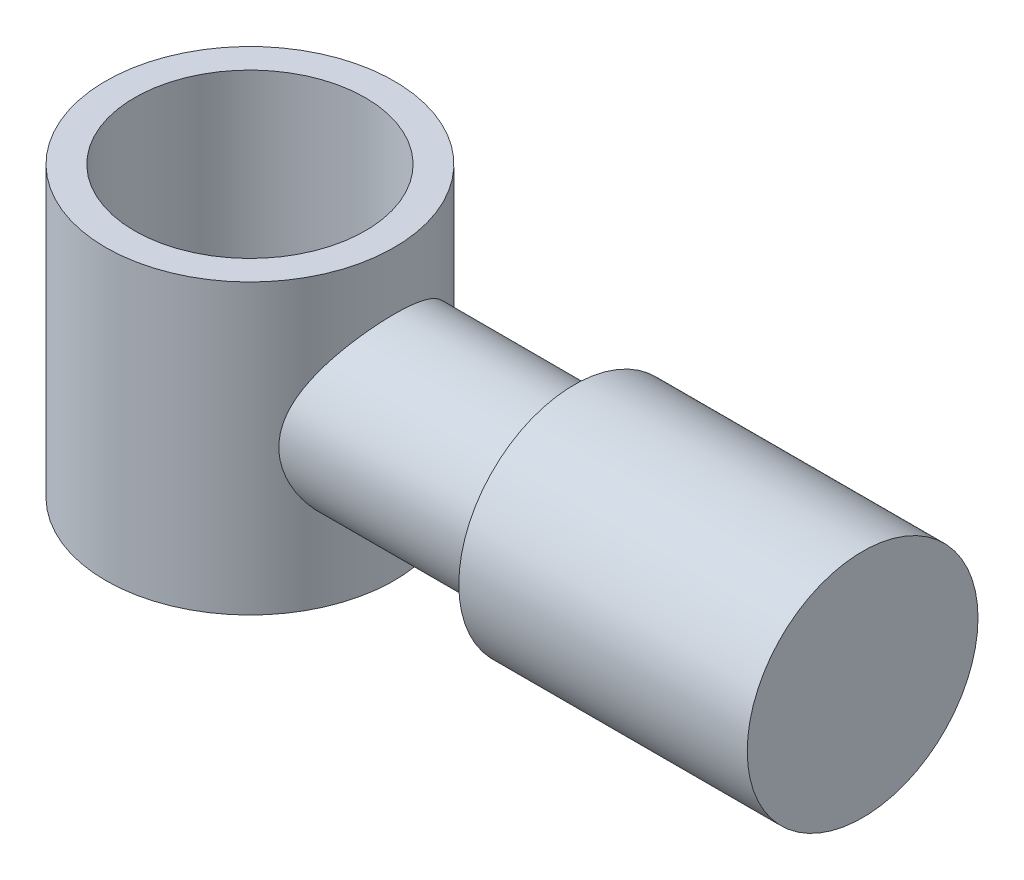
ISO-10303-21;
HEADER;
FILE_DESCRIPTION(('STEP AP214'),'2;1');
FILE_NAME('part.step','',(''),(''),'','','');
FILE_SCHEMA(('AUTOMOTIVE_DESIGN { 1 0 10303 214 1 1 1 1 }'));
ENDSEC;
DATA;
#1=APPLICATION_CONTEXT('core data for automotive mechanical design processes');
#2=APPLICATION_PROTOCOL_DEFINITION('international standard','automotive_design',2000,#1);
#3=PRODUCT_CONTEXT('',#1,'mechanical');
#4=PRODUCT('Part','Part','',(#3));
#5=PRODUCT_RELATED_PRODUCT_CATEGORY('part','',(#4));
#6=PRODUCT_DEFINITION_FORMATION('','',#4);
#7=PRODUCT_DEFINITION_CONTEXT('part definition',#1,'design');
#8=PRODUCT_DEFINITION('design','',#6,#7);
#9=PRODUCT_DEFINITION_SHAPE('','',#8);
#10=(LENGTH_UNIT() NAMED_UNIT(*) SI_UNIT(.MILLI.,.METRE.));
#11=(NAMED_UNIT(*) PLANE_ANGLE_UNIT() SI_UNIT($,.RADIAN.));
#12=(NAMED_UNIT(*) SI_UNIT($,.STERADIAN.) SOLID_ANGLE_UNIT());
#13=UNCERTAINTY_MEASURE_WITH_UNIT(LENGTH_MEASURE(1.E-05),#10,'distance_accuracy_value','');
#14=(GEOMETRIC_REPRESENTATION_CONTEXT(3) GLOBAL_UNCERTAINTY_ASSIGNED_CONTEXT((#13)) GLOBAL_UNIT_ASSIGNED_CONTEXT((#10,
#11,#12)) REPRESENTATION_CONTEXT('',''));
#15=CARTESIAN_POINT('',(0.,0.,0.));
#16=DIRECTION('',(0.,0.,1.));
#17=DIRECTION('',(1.,0.,0.));
#18=AXIS2_PLACEMENT_3D('',#15,#16,#17);
#19=CARTESIAN_POINT('',(0.,50.,0.));
#20=DIRECTION('',(0.,-1.,0.));
#21=DIRECTION('',(0.,0.,-1.));
#22=AXIS2_PLACEMENT_3D('',#19,#20,#21);
#23=CYLINDRICAL_SURFACE('',#22,50.);
#24=CARTESIAN_POINT('',(40.,0.,-30.));
#25=CARTESIAN_POINT('',(39.9999924355509,-0.754773079428565,-30.0000054371733));
#26=CARTESIAN_POINT('',(40.0214403954393,-1.50948924622845,-29.9714752342614));
#27=CARTESIAN_POINT('',(40.1062444493847,-3.0122226461602,-29.8578998383123));
#28=CARTESIAN_POINT('',(40.1695977533699,-3.76024032191946,-29.7728584078095));
#29=CARTESIAN_POINT('',(40.3355499097489,-5.2441364599569,-29.5476372030003));
#30=CARTESIAN_POINT('',(40.438184622088,-5.98000318745316,-29.4074070436577));
#31=CARTESIAN_POINT('',(40.6785728662393,-7.43373400086841,-29.0739716563499));
#32=CARTESIAN_POINT('',(40.8163282339694,-8.15159714350204,-28.8807636589501));
#33=CARTESIAN_POINT('',(41.1208174466127,-9.55986424580085,-28.445531905068));
#34=CARTESIAN_POINT('',(41.2873290187728,-10.2504322497716,-28.2038804459786));
#35=CARTESIAN_POINT('',(41.644790948041,-11.6067524308452,-27.6733374325039));
#36=CARTESIAN_POINT('',(41.8357445215649,-12.2725013269922,-27.3844396594046));
#37=CARTESIAN_POINT('',(42.1364605134893,-13.2505717076948,-26.9175218389558));
#38=CARTESIAN_POINT('',(42.2391003045645,-13.5732271148505,-26.756254628249));
#39=CARTESIAN_POINT('',(42.4484734074239,-14.2113934734989,-26.4228282782668));
#40=CARTESIAN_POINT('',(42.5552056486378,-14.5269062595888,-26.2506719799854));
#41=CARTESIAN_POINT('',(42.8806472634173,-15.4626009873731,-25.7181480386));
#42=CARTESIAN_POINT('',(43.1045955804228,-16.0719201724563,-25.3417344973462));
#43=CARTESIAN_POINT('',(43.5893887462092,-17.3324425072035,-24.499575785768));
#44=CARTESIAN_POINT('',(43.8513964328546,-17.9796546133088,-24.0285354757498));
#45=CARTESIAN_POINT('',(44.3801358051688,-19.233290460478,-23.0373408991427));
#46=CARTESIAN_POINT('',(44.6468677620499,-19.8397118501679,-22.5171838053726));
#47=CARTESIAN_POINT('',(45.1790404761606,-21.0099367523766,-21.4294452953907));
#48=CARTESIAN_POINT('',(45.4444801847927,-21.573709768574,-20.8618305432127));
#49=CARTESIAN_POINT('',(45.9679876279243,-22.6556839826832,-19.681488615426));
#50=CARTESIAN_POINT('',(46.2260549858159,-23.1738828552944,-19.0687591408844));
#51=CARTESIAN_POINT('',(46.7564021460829,-24.2153507973842,-17.7316223686081));
#52=CARTESIAN_POINT('',(47.0271973104288,-24.7330987799033,-17.0023054886216));
#53=CARTESIAN_POINT('',(47.5453815754836,-25.7047112154735,-15.4942685286804));
#54=CARTESIAN_POINT('',(47.7927685483637,-26.158569862743,-14.715543968244));
#55=CARTESIAN_POINT('',(48.2568802958075,-26.9971922251109,-13.1136665383535));
#56=CARTESIAN_POINT('',(48.4736264229592,-27.3820041074603,-12.2905451657093));
#57=CARTESIAN_POINT('',(48.870041879193,-28.0777989799473,-10.6050928823802));
#58=CARTESIAN_POINT('',(49.0497173006521,-28.3887941027499,-9.74276844298749));
#59=CARTESIAN_POINT('',(49.3510766635053,-28.9062031952631,-8.06989441005334));
#60=CARTESIAN_POINT('',(49.4766580911894,-29.1197644658465,-7.26225533212928));
#61=CARTESIAN_POINT('',(49.6891894498777,-29.4794276662173,-5.62706899055213));
#62=CARTESIAN_POINT('',(49.7761416205889,-29.6255335070595,-4.79952288403311));
#63=CARTESIAN_POINT('',(49.9087796773502,-29.8478515838854,-3.13246717024253));
#64=CARTESIAN_POINT('',(49.9544978737898,-29.924118545397,-2.29296745458034));
#65=CARTESIAN_POINT('',(50.0033768126454,-30.0056462782551,-0.609322714269916));
#66=CARTESIAN_POINT('',(50.0065418849347,-30.0109142739014,0.234821829012514));
#67=CARTESIAN_POINT('',(49.9725033434349,-29.95415500019,1.81489529981785));
#68=CARTESIAN_POINT('',(49.9402633154867,-29.9004022371462,2.55124667795299));
#69=CARTESIAN_POINT('',(49.8438693758083,-29.739124395353,4.01585794086052));
#70=CARTESIAN_POINT('',(49.7797187521094,-29.6316048566647,4.74411865138387));
#71=CARTESIAN_POINT('',(49.620977165127,-29.3641437085351,6.18756243161352));
#72=CARTESIAN_POINT('',(49.5263851106974,-29.20420022,6.90274503157525));
#73=CARTESIAN_POINT('',(49.3088598139461,-28.8337670024337,8.31547959196037));
#74=CARTESIAN_POINT('',(49.1859254038559,-28.6232751906837,9.01303082461759));
#75=CARTESIAN_POINT('',(48.9135476146462,-28.1526581576168,10.3904072750655));
#76=CARTESIAN_POINT('',(48.7639571594241,-27.8922569228414,11.0701088227145));
#77=CARTESIAN_POINT('',(48.441789827711,-27.3251067169327,12.4041910107697));
#78=CARTESIAN_POINT('',(48.2692131671293,-27.0183581811358,13.0585718889383));
#79=CARTESIAN_POINT('',(47.9043659781244,-26.3610135406394,14.3392870539587));
#80=CARTESIAN_POINT('',(47.7120927225473,-26.0104113625566,14.9656174396906));
#81=CARTESIAN_POINT('',(47.3113861831583,-25.2678641870583,16.1878487666349));
#82=CARTESIAN_POINT('',(47.1029518864841,-24.8759165978422,16.783747796732));
#83=CARTESIAN_POINT('',(46.6479274519125,-24.0038251222862,18.0124884902317));
#84=CARTESIAN_POINT('',(46.3997536842666,-23.5187386533106,18.6412397419404));
#85=CARTESIAN_POINT('',(45.8930644751573,-22.502607304962,19.8559772510624));
#86=CARTESIAN_POINT('',(45.6345483218784,-21.9715592593429,20.4419605571017));
#87=CARTESIAN_POINT('',(45.1123778800076,-20.8653945949799,21.569887598821));
#88=CARTESIAN_POINT('',(44.8487174528413,-20.2902225786288,22.1117741531459));
#89=CARTESIAN_POINT('',(44.3223864406096,-19.0986815642021,23.1487409834838));
#90=CARTESIAN_POINT('',(44.0597159018081,-18.4823106652618,23.6438190972658));
#91=CARTESIAN_POINT('',(43.5114023855333,-17.1365792062999,24.6397506704863));
#92=CARTESIAN_POINT('',(43.2266309181986,-16.4024071704545,25.134607075518));
#93=CARTESIAN_POINT('',(42.6750161739419,-14.8880542042171,26.060187845091));
#94=CARTESIAN_POINT('',(42.4081758489753,-14.107865737769,26.4909016641373));
#95=CARTESIAN_POINT('',(41.9025771259453,-12.5060980569954,27.2835991057643));
#96=CARTESIAN_POINT('',(41.663776855557,-11.6845832451743,27.6456857193192));
#97=CARTESIAN_POINT('',(41.2239700066492,-10.0036296959614,28.2973336841537));
#98=CARTESIAN_POINT('',(41.0229485892923,-9.144206012938,28.586923525734));
#99=CARTESIAN_POINT('',(40.7124607158074,-7.61055439517443,29.0266922229524));
#100=CARTESIAN_POINT('',(40.5926498926779,-6.94318574540926,29.1936352760004));
#101=CARTESIAN_POINT('',(40.3837646228614,-5.59394741557895,29.4819157838905));
#102=CARTESIAN_POINT('',(40.2946852685501,-4.91208006934632,29.6032605207762));
#103=CARTESIAN_POINT('',(40.1504262123343,-3.53871644845567,29.7986252970483));
#104=CARTESIAN_POINT('',(40.0952129290315,-2.847230409919,29.8726922198134));
#105=CARTESIAN_POINT('',(40.0205909917451,-1.45881623193731,29.9725913229736));
#106=CARTESIAN_POINT('',(40.0011830970955,-0.761887977392609,29.9984224804208));
#107=CARTESIAN_POINT('',(39.9989205730711,0.633092969562075,30.001439292512));
#108=CARTESIAN_POINT('',(40.016116263115,1.33114588996814,29.9785579814936));
#109=CARTESIAN_POINT('',(40.0864993514701,2.72212786656803,29.8843768935634));
#110=CARTESIAN_POINT('',(40.1396869372494,3.41505689605442,29.8130768644567));
#111=CARTESIAN_POINT('',(40.2801155116223,4.79132027707059,29.6230684849219));
#112=CARTESIAN_POINT('',(40.3673793756117,5.47464786325117,29.5043282866804));
#113=CARTESIAN_POINT('',(40.5729035284754,6.82695351863887,29.2210546703214));
#114=CARTESIAN_POINT('',(40.6911646881071,7.49593118416539,29.0565199657639));
#115=CARTESIAN_POINT('',(40.9546817127304,8.81493130388343,28.6838971255832));
#116=CARTESIAN_POINT('',(41.099893970628,9.46498244311764,28.4758792783311));
#117=CARTESIAN_POINT('',(41.4133350881076,10.7447421919884,28.0180764187168));
#118=CARTESIAN_POINT('',(41.5815731918176,11.3744425052817,27.7682746224651));
#119=CARTESIAN_POINT('',(41.9367586997092,12.6112149171688,27.2288911048792));
#120=CARTESIAN_POINT('',(42.1237096452986,13.2182827026054,26.9393018498846));
#121=CARTESIAN_POINT('',(42.5119906697039,14.4078239321894,26.3223000055147));
#122=CARTESIAN_POINT('',(42.713317060781,14.9903036233565,25.9948971032765));
#123=CARTESIAN_POINT('',(43.1636078905243,16.2323716245478,25.2414085206861));
#124=CARTESIAN_POINT('',(43.4146109863377,16.8868967379914,24.8081780488878));
#125=CARTESIAN_POINT('',(43.9246536038002,18.1580335537829,23.8934940052003));
#126=CARTESIAN_POINT('',(44.1836938512659,18.7746418168658,23.4120360691993));
#127=CARTESIAN_POINT('',(44.7040326920285,19.9684598947072,22.4025038732756));
#128=CARTESIAN_POINT('',(44.9653330646558,20.5456347277241,21.8743891519663));
#129=CARTESIAN_POINT('',(45.4842796758364,21.6578301169655,20.7737943393439));
#130=CARTESIAN_POINT('',(45.7419257245319,22.1928484895119,20.2013119528565));
#131=CARTESIAN_POINT('',(46.2811171660542,23.2851001855273,18.9364779766343));
#132=CARTESIAN_POINT('',(46.5614043507672,23.8361500707667,18.2382257014387));
#133=CARTESIAN_POINT('',(47.1028396436449,24.8772013130106,16.7904682073809));
#134=CARTESIAN_POINT('',(47.3639857916585,25.367196421245,16.0409577545394));
#135=CARTESIAN_POINT('',(47.8597679650153,26.281262214501,14.4948690885772));
#136=CARTESIAN_POINT('',(48.0944166466547,26.7053644094267,13.6983136253921));
#137=CARTESIAN_POINT('',(48.5304710877414,27.4829085808844,12.0627242110709));
#138=CARTESIAN_POINT('',(48.731881378668,27.8363601907911,11.2236960707639));
#139=CARTESIAN_POINT('',(49.0820154369011,28.4447091895007,9.57163089673217));
#140=CARTESIAN_POINT('',(49.2335028420043,28.7048990218314,8.76112996669413));
#141=CARTESIAN_POINT('',(49.4981910314828,29.1565507968783,7.11503534150898));
#142=CARTESIAN_POINT('',(49.6113932400335,29.3480152961319,6.27944258101491));
#143=CARTESIAN_POINT('',(49.7959943798632,29.6590072808807,4.59121918613498));
#144=CARTESIAN_POINT('',(49.8674326814406,29.7786025195841,3.73860538410504));
#145=CARTESIAN_POINT('',(49.9664050743555,29.9440494730322,2.02375863082273));
#146=CARTESIAN_POINT('',(49.9939448890237,29.989910800952,1.16152694827898));
#147=CARTESIAN_POINT('',(50.0035796163062,30.0059636845279,-0.44863836959643));
#148=CARTESIAN_POINT('',(49.9912497430118,29.9854383726646,-1.19646649879256));
#149=CARTESIAN_POINT('',(49.9333091422452,29.8887419424398,-2.68715701856051));
#150=CARTESIAN_POINT('',(49.8877020198906,29.8125768518574,-3.43001993824537));
#151=CARTESIAN_POINT('',(49.7643009048837,29.6056163790939,-4.90534527411017));
#152=CARTESIAN_POINT('',(49.6865071367958,29.4748213780623,-5.63780776281639));
#153=CARTESIAN_POINT('',(49.5005437474305,29.160245460038,-7.0873223698818));
#154=CARTESIAN_POINT('',(49.3923732157727,28.9764629550249,-7.80437402569054));
#155=CARTESIAN_POINT('',(49.1500473875609,28.5614260115334,-9.20713596965784));
#156=CARTESIAN_POINT('',(49.0163393490528,28.3309850756384,-9.89316522831643));
#157=CARTESIAN_POINT('',(48.7246154429874,27.8232155122072,-11.242249514208));
#158=CARTESIAN_POINT('',(48.5666001756052,27.5458880423398,-11.9053051081935));
#159=CARTESIAN_POINT('',(48.2293178600434,26.946769704929,-13.2054545723106));
#160=CARTESIAN_POINT('',(48.0500484828003,26.6249739638318,-13.8425455868989));
#161=CARTESIAN_POINT('',(47.6735789595604,25.9393946780803,-15.0881846024373));
#162=CARTESIAN_POINT('',(47.4763776858225,25.5756084922492,-15.6967308045441));
#163=CARTESIAN_POINT('',(47.0453184951055,24.7667424868672,-16.9476190424841));
#164=CARTESIAN_POINT('',(46.8098051726833,24.317124761882,-17.5864585689585));
#165=CARTESIAN_POINT('',(46.325936934833,23.3721450786188,-18.8241654588664));
#166=CARTESIAN_POINT('',(46.0775812628444,22.876780423972,-19.4230304625739));
#167=CARTESIAN_POINT('',(45.5728772295248,21.8424161446594,-20.5793876993337));
#168=CARTESIAN_POINT('',(45.3165210670254,21.3033730570058,-21.1368376378641));
#169=CARTESIAN_POINT('',(44.8013865884645,20.1844237054672,-22.2078589213948));
#170=CARTESIAN_POINT('',(44.5426081325414,19.6045150692523,-22.7214277151681));
#171=CARTESIAN_POINT('',(43.9954895932492,18.329631573187,-23.7652386100365));
#172=CARTESIAN_POINT('',(43.7075675480209,17.6293953373685,-24.2893195038196));
#173=CARTESIAN_POINT('',(43.2851540783708,16.5443485377289,-25.0295083694434));
#174=CARTESIAN_POINT('',(43.1459165421275,16.1768518277079,-25.2686007562634));
#175=CARTESIAN_POINT('',(42.8716442524079,15.4304379178484,-25.731195664513));
#176=CARTESIAN_POINT('',(42.7366110683665,15.0515165547962,-25.9546924020116));
#177=CARTESIAN_POINT('',(42.3397557549876,13.8987545541486,-26.6007590168042));
#178=CARTESIAN_POINT('',(42.0859808338299,13.1084169941735,-26.999246247833));
#179=CARTESIAN_POINT('',(41.6097198076573,11.4877271374779,-27.7276182166737));
#180=CARTESIAN_POINT('',(41.3872256518336,10.6573852109229,-28.0575206168377));
#181=CARTESIAN_POINT('',(41.0929389990196,9.42187298081651,-28.4850286249539));
#182=CARTESIAN_POINT('',(41.0048657325039,9.03038758470868,-28.6115719641199));
#183=CARTESIAN_POINT('',(40.8382373313778,8.24078837678755,-28.8489055913011));
#184=CARTESIAN_POINT('',(40.7596797970073,7.84267626508385,-28.9596998522838));
#185=CARTESIAN_POINT('',(40.5395886546573,6.63922693192673,-29.2678307379545));
#186=CARTESIAN_POINT('',(40.4135940279387,5.82460119453231,-29.440976404297));
#187=CARTESIAN_POINT('',(40.209493955114,4.17951386891395,-29.7191257226127));
#188=CARTESIAN_POINT('',(40.1312994945307,3.34908470349394,-29.8242560556143));
#189=CARTESIAN_POINT('',(40.0265599738779,1.67907944636471,-29.9646857763522));
#190=CARTESIAN_POINT('',(40.0000084136404,0.839504519189612,-29.9999939524452));
#191=CARTESIAN_POINT('',(40.,0.,-30.));
#192=B_SPLINE_CURVE_WITH_KNOTS('',3,(#24,#25,#26,#27,#28,#29,#30,#31,#32,#33,#34,#35,#36,#37,
#38,#39,#40,#41,#42,#43,#44,#45,#46,#47,#48,#49,#50,#51,#52,#53,#54,#55,#56,#57,#58,#59,#60,#61,
#62,#63,#64,#65,#66,#67,#68,#69,#70,#71,#72,#73,#74,#75,#76,#77,#78,#79,#80,#81,#82,#83,#84,#85,
#86,#87,#88,#89,#90,#91,#92,#93,#94,#95,#96,#97,#98,#99,#100,#101,#102,#103,#104,#105,#106,#107,
#108,#109,#110,#111,#112,#113,#114,#115,#116,#117,#118,#119,#120,#121,#122,#123,#124,#125,#126,
#127,#128,#129,#130,#131,#132,#133,#134,#135,#136,#137,#138,#139,#140,#141,#142,#143,#144,#145,
#146,#147,#148,#149,#150,#151,#152,#153,#154,#155,#156,#157,#158,#159,#160,#161,#162,#163,#164,
#165,#166,#167,#168,#169,#170,#171,#172,#173,#174,#175,#176,#177,#178,#179,#180,#181,#182,#183,
#184,#185,#186,#187,#188,#189,#190,#191),.UNSPECIFIED.,.T.,.F.,(4,2,2,2,2,2,2,2,2,2,2,2,2,2,2,2,
2,2,2,2,2,2,2,2,2,2,2,2,2,2,2,2,2,2,2,2,2,2,2,2,2,2,2,2,2,2,2,2,2,2,2,2,2,2,2,2,2,2,2,2,2,2,2,2,
2,2,2,2,2,2,2,2,2,2,2,2,2,2,2,2,2,2,2,4),(0.,2.26339065976523,4.52663063739906,6.79194167103308,
9.05737114715353,11.3060153718576,13.5549558090047,14.6798398054329,15.8044315174353,
18.053680844433,20.578006829107,23.1024782036475,25.6287380005962,28.1551266186056,
30.954941350871,33.7550103451903,36.553118342749,39.3507661189212,41.8814765390891,
44.4120402106454,46.9406192393127,49.4689409776018,51.683333411791,53.8974977247651,
56.1117414113421,58.3260763460167,60.5530302662239,62.7799632701391,65.0072050288865,
67.2345864887666,69.7280443332067,72.2216740863463,74.71848750613,77.2154162053875,
80.002108172649,82.7892577871951,85.5721909336379,88.354028700165,90.446781170665,
92.5391992867496,94.6295392047497,96.7199234526042,98.8131832342802,100.906453919041,
103.001132238211,105.095869406138,107.187246361405,109.279465412906,111.372081168462,
113.46416201983,115.933925800171,118.403913272111,120.876064180349,123.348343060374,
126.142642921312,128.937228535818,131.730473642596,134.523337623591,137.113418055671,
139.703402128459,142.290940703078,144.878141895905,147.120010063233,149.361635392023,
151.603245081396,153.844921958156,156.05044208409,158.25590776179,160.461615342147,
162.667461736035,165.112763633141,167.558209750834,170.006119860739,172.454172194157,
175.21302745175,176.592687183034,177.972855896356,180.731292892543,183.489018638118,
184.750877047949,186.012416565873,188.534926127152,191.052723792891,193.57020452896),.UNSPECIFIED.);
#193=CARTESIAN_POINT('',(40.,0.,-30.));
#194=VERTEX_POINT('',#193);
#195=EDGE_CURVE('E56',#194,#194,#192,.T.);
#196=ORIENTED_EDGE('',*,*,#195,.T.);
#197=EDGE_LOOP('',(#196));
#198=FACE_BOUND('',#197,.T.);
#199=ADVANCED_FACE('F51',(#198),#23,.F.);
#200=CARTESIAN_POINT('',(112.4,0.,0.));
#201=DIRECTION('',(-1.,0.,0.));
#202=DIRECTION('',(0.,0.,1.));
#203=AXIS2_PLACEMENT_3D('',#200,#201,#202);
#204=PLANE('',#203);
#205=CARTESIAN_POINT('',(112.4,0.,0.));
#206=DIRECTION('',(-1.,0.,0.));
#207=DIRECTION('',(0.,0.,1.));
#208=AXIS2_PLACEMENT_3D('',#205,#206,#207);
#209=CIRCLE('',#208,30.);
#210=CARTESIAN_POINT('',(112.4,0.,30.));
#211=VERTEX_POINT('',#210);
#212=EDGE_CURVE('E12',#211,#211,#209,.T.);
#213=ORIENTED_EDGE('',*,*,#212,.F.);
#214=EDGE_LOOP('',(#213));
#215=FACE_BOUND('',#214,.T.);
#216=ADVANCED_FACE('F70',(#215),#204,.F.);
#217=CARTESIAN_POINT('',(-50.002,0.,0.));
#218=DIRECTION('',(1.,0.,0.));
#219=DIRECTION('',(0.,0.,-1.));
#220=AXIS2_PLACEMENT_3D('',#217,#218,#219);
#221=CYLINDRICAL_SURFACE('',#220,30.);
#222=ORIENTED_EDGE('',*,*,#212,.T.);
#223=EDGE_LOOP('',(#222));
#224=FACE_BOUND('',#223,.T.);
#225=ORIENTED_EDGE('',*,*,#195,.F.);
#226=EDGE_LOOP('',(#225));
#227=FACE_BOUND('',#226,.T.);
#228=ADVANCED_FACE('F53',(#224,#227),#221,.T.);
#229=CLOSED_SHELL('',(#199,#216,#228));
#230=MANIFOLD_SOLID_BREP('B2',#229);
#231=CARTESIAN_POINT('',(212.4,0.,0.));
#232=DIRECTION('',(-1.,0.,0.));
#233=DIRECTION('',(0.,0.,1.));
#234=AXIS2_PLACEMENT_3D('',#231,#232,#233);
#235=CYLINDRICAL_SURFACE('',#234,40.);
#236=CARTESIAN_POINT('',(212.4,0.,0.));
#237=DIRECTION('',(1.,0.,0.));
#238=DIRECTION('',(0.,0.,-1.));
#239=AXIS2_PLACEMENT_3D('',#236,#237,#238);
#240=CIRCLE('',#239,40.);
#241=CARTESIAN_POINT('',(212.4,0.,-40.));
#242=VERTEX_POINT('',#241);
#243=EDGE_CURVE('E50',#242,#242,#240,.T.);
#244=ORIENTED_EDGE('',*,*,#243,.F.);
#245=EDGE_LOOP('',(#244));
#246=FACE_BOUND('',#245,.T.);
#247=CARTESIAN_POINT('',(112.4,0.,0.));
#248=DIRECTION('',(1.,0.,0.));
#249=DIRECTION('',(0.,0.,-1.));
#250=AXIS2_PLACEMENT_3D('',#247,#248,#249);
#251=CIRCLE('',#250,40.);
#252=CARTESIAN_POINT('',(112.4,0.,-40.));
#253=VERTEX_POINT('',#252);
#254=EDGE_CURVE('E106',#253,#253,#251,.T.);
#255=ORIENTED_EDGE('',*,*,#254,.T.);
#256=EDGE_LOOP('',(#255));
#257=FACE_BOUND('',#256,.T.);
#258=ADVANCED_FACE('F103',(#246,#257),#235,.T.);
#259=CARTESIAN_POINT('',(212.4,0.,0.));
#260=DIRECTION('',(1.,0.,0.));
#261=DIRECTION('',(0.,0.,-1.));
#262=AXIS2_PLACEMENT_3D('',#259,#260,#261);
#263=PLANE('',#262);
#264=ORIENTED_EDGE('',*,*,#243,.T.);
#265=EDGE_LOOP('',(#264));
#266=FACE_BOUND('',#265,.T.);
#267=ADVANCED_FACE('F118',(#266),#263,.T.);
#268=CARTESIAN_POINT('',(112.4,0.,0.));
#269=DIRECTION('',(1.,0.,0.));
#270=DIRECTION('',(0.,0.,-1.));
#271=AXIS2_PLACEMENT_3D('',#268,#269,#270);
#272=PLANE('',#271);
#273=ORIENTED_EDGE('',*,*,#254,.F.);
#274=EDGE_LOOP('',(#273));
#275=FACE_BOUND('',#274,.T.);
#276=ADVANCED_FACE('F116',(#275),#272,.F.);
#277=CLOSED_SHELL('',(#258,#267,#276));
#278=MANIFOLD_SOLID_BREP('B7',#277);
#279=CARTESIAN_POINT('',(0.,50.,0.));
#280=DIRECTION('',(0.,1.,0.));
#281=DIRECTION('',(0.,0.,1.));
#282=AXIS2_PLACEMENT_3D('',#279,#280,#281);
#283=PLANE('',#282);
#284=CARTESIAN_POINT('',(0.,50.,0.));
#285=DIRECTION('',(0.,1.,0.));
#286=DIRECTION('',(0.,0.,1.));
#287=AXIS2_PLACEMENT_3D('',#284,#285,#286);
#288=CIRCLE('',#287,50.);
#289=CARTESIAN_POINT('',(0.,50.,50.));
#290=VERTEX_POINT('',#289);
#291=EDGE_CURVE('E102',#290,#290,#288,.T.);
#292=ORIENTED_EDGE('',*,*,#291,.T.);
#293=EDGE_LOOP('',(#292));
#294=FACE_BOUND('',#293,.T.);
#295=CARTESIAN_POINT('',(0.,50.,0.));
#296=DIRECTION('',(0.,1.,0.));
#297=DIRECTION('',(0.,0.,1.));
#298=AXIS2_PLACEMENT_3D('',#295,#296,#297);
#299=CIRCLE('',#298,40.);
#300=CARTESIAN_POINT('',(0.,50.,40.));
#301=VERTEX_POINT('',#300);
#302=EDGE_CURVE('E154',#301,#301,#299,.T.);
#303=ORIENTED_EDGE('',*,*,#302,.F.);
#304=EDGE_LOOP('',(#303));
#305=FACE_BOUND('',#304,.T.);
#306=ADVANCED_FACE('F143',(#294,#305),#283,.T.);
#307=CARTESIAN_POINT('',(0.,-50.,0.));
#308=DIRECTION('',(0.,1.,0.));
#309=DIRECTION('',(0.,0.,1.));
#310=AXIS2_PLACEMENT_3D('',#307,#308,#309);
#311=PLANE('',#310);
#312=CARTESIAN_POINT('',(0.,-50.,0.));
#313=DIRECTION('',(0.,1.,0.));
#314=DIRECTION('',(0.,0.,1.));
#315=AXIS2_PLACEMENT_3D('',#312,#313,#314);
#316=CIRCLE('',#315,50.);
#317=CARTESIAN_POINT('',(0.,-50.,50.));
#318=VERTEX_POINT('',#317);
#319=EDGE_CURVE('E147',#318,#318,#316,.T.);
#320=ORIENTED_EDGE('',*,*,#319,.F.);
#321=EDGE_LOOP('',(#320));
#322=FACE_BOUND('',#321,.T.);
#323=CARTESIAN_POINT('',(0.,-50.,0.));
#324=DIRECTION('',(0.,1.,0.));
#325=DIRECTION('',(0.,0.,1.));
#326=AXIS2_PLACEMENT_3D('',#323,#324,#325);
#327=CIRCLE('',#326,40.);
#328=CARTESIAN_POINT('',(0.,-50.,40.));
#329=VERTEX_POINT('',#328);
#330=EDGE_CURVE('E156',#329,#329,#327,.T.);
#331=ORIENTED_EDGE('',*,*,#330,.T.);
#332=EDGE_LOOP('',(#331));
#333=FACE_BOUND('',#332,.T.);
#334=ADVANCED_FACE('F166',(#322,#333),#311,.F.);
#335=CARTESIAN_POINT('',(0.,50.,0.));
#336=DIRECTION('',(0.,-1.,0.));
#337=DIRECTION('',(0.,0.,-1.));
#338=AXIS2_PLACEMENT_3D('',#335,#336,#337);
#339=CYLINDRICAL_SURFACE('',#338,50.);
#340=ORIENTED_EDGE('',*,*,#291,.F.);
#341=EDGE_LOOP('',(#340));
#342=FACE_BOUND('',#341,.T.);
#343=ORIENTED_EDGE('',*,*,#319,.T.);
#344=EDGE_LOOP('',(#343));
#345=FACE_BOUND('',#344,.T.);
#346=ADVANCED_FACE('F145',(#342,#345),#339,.T.);
#347=CARTESIAN_POINT('',(0.,50.,0.));
#348=DIRECTION('',(0.,-1.,0.));
#349=DIRECTION('',(0.,0.,-1.));
#350=AXIS2_PLACEMENT_3D('',#347,#348,#349);
#351=CYLINDRICAL_SURFACE('',#350,40.);
#352=ORIENTED_EDGE('',*,*,#302,.T.);
#353=EDGE_LOOP('',(#352));
#354=FACE_BOUND('',#353,.T.);
#355=ORIENTED_EDGE('',*,*,#330,.F.);
#356=EDGE_LOOP('',(#355));
#357=FACE_BOUND('',#356,.T.);
#358=ADVANCED_FACE('F162',(#354,#357),#351,.F.);
#359=CLOSED_SHELL('',(#306,#334,#346,#358));
#360=MANIFOLD_SOLID_BREP('B45',#359);
#361=ADVANCED_BREP_SHAPE_REPRESENTATION('',(#18,#230,#278,#360),#14);
#362=SHAPE_DEFINITION_REPRESENTATION(#9,#361);
ENDSEC;
END-ISO-10303-21;
